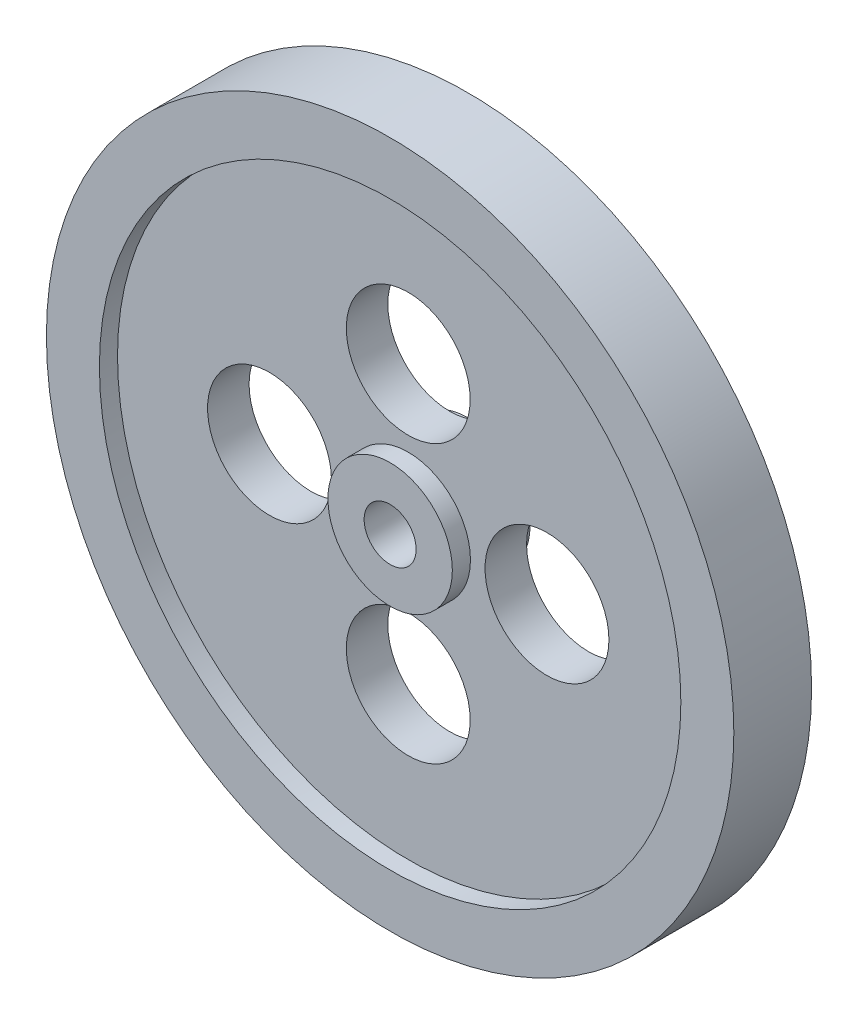
ISO-10303-21;
HEADER;
FILE_DESCRIPTION(('STEP AP214'),'2;1');
FILE_NAME('part.step','',(''),(''),'','','');
FILE_SCHEMA(('AUTOMOTIVE_DESIGN { 1 0 10303 214 1 1 1 1 }'));
ENDSEC;
DATA;
#1=APPLICATION_CONTEXT('core data for automotive mechanical design processes');
#2=APPLICATION_PROTOCOL_DEFINITION('international standard','automotive_design',2000,#1);
#3=PRODUCT_CONTEXT('',#1,'mechanical');
#4=PRODUCT('Part','Part','',(#3));
#5=PRODUCT_RELATED_PRODUCT_CATEGORY('part','',(#4));
#6=PRODUCT_DEFINITION_FORMATION('','',#4);
#7=PRODUCT_DEFINITION_CONTEXT('part definition',#1,'design');
#8=PRODUCT_DEFINITION('design','',#6,#7);
#9=PRODUCT_DEFINITION_SHAPE('','',#8);
#10=(LENGTH_UNIT() NAMED_UNIT(*) SI_UNIT(.MILLI.,.METRE.));
#11=(NAMED_UNIT(*) PLANE_ANGLE_UNIT() SI_UNIT($,.RADIAN.));
#12=(NAMED_UNIT(*) SI_UNIT($,.STERADIAN.) SOLID_ANGLE_UNIT());
#13=UNCERTAINTY_MEASURE_WITH_UNIT(LENGTH_MEASURE(1.E-05),#10,'distance_accuracy_value','');
#14=(GEOMETRIC_REPRESENTATION_CONTEXT(3) GLOBAL_UNCERTAINTY_ASSIGNED_CONTEXT((#13)) GLOBAL_UNIT_ASSIGNED_CONTEXT((#10,
#11,#12)) REPRESENTATION_CONTEXT('',''));
#15=CARTESIAN_POINT('',(0.,0.,0.));
#16=DIRECTION('',(0.,0.,1.));
#17=DIRECTION('',(1.,0.,0.));
#18=AXIS2_PLACEMENT_3D('',#15,#16,#17);
#19=CARTESIAN_POINT('',(0.,0.,-2.79));
#20=DIRECTION('',(0.,0.,1.));
#21=DIRECTION('',(1.,0.,0.));
#22=AXIS2_PLACEMENT_3D('',#19,#20,#21);
#23=PLANE('',#22);
#24=CARTESIAN_POINT('',(0.,0.,-2.79));
#25=DIRECTION('',(0.,0.,1.));
#26=DIRECTION('',(1.,0.,0.));
#27=AXIS2_PLACEMENT_3D('',#24,#25,#26);
#28=CIRCLE('',#27,1.8669);
#29=CARTESIAN_POINT('',(1.8669,0.,-2.79));
#30=VERTEX_POINT('',#29);
#31=EDGE_CURVE('E52',#30,#30,#28,.T.);
#32=ORIENTED_EDGE('',*,*,#31,.T.);
#33=EDGE_LOOP('',(#32));
#34=FACE_BOUND('',#33,.T.);
#35=CARTESIAN_POINT('',(0.,0.,-2.79));
#36=DIRECTION('',(0.,0.,1.));
#37=DIRECTION('',(1.,0.,0.));
#38=AXIS2_PLACEMENT_3D('',#35,#36,#37);
#39=CIRCLE('',#38,4.465);
#40=CARTESIAN_POINT('',(4.465,0.,-2.79));
#41=VERTEX_POINT('',#40);
#42=EDGE_CURVE('E97',#41,#41,#39,.T.);
#43=ORIENTED_EDGE('',*,*,#42,.F.);
#44=EDGE_LOOP('',(#43));
#45=FACE_BOUND('',#44,.T.);
#46=ADVANCED_FACE('F37',(#34,#45),#23,.F.);
#47=CARTESIAN_POINT('',(-9.9568,1.0364604480397E-13,-2.79));
#48=DIRECTION('',(0.,0.,1.));
#49=DIRECTION('',(1.,0.,0.));
#50=AXIS2_PLACEMENT_3D('',#47,#48,#49);
#51=CYLINDRICAL_SURFACE('',#50,4.445);
#52=CARTESIAN_POINT('',(-9.9568,1.0364604480397E-13,1.49));
#53=DIRECTION('',(0.,0.,1.));
#54=DIRECTION('',(1.,0.,0.));
#55=AXIS2_PLACEMENT_3D('',#52,#53,#54);
#56=CIRCLE('',#55,4.445);
#57=CARTESIAN_POINT('',(-5.5118,1.0364604480397E-13,1.49));
#58=VERTEX_POINT('',#57);
#59=EDGE_CURVE('E70',#58,#58,#56,.T.);
#60=ORIENTED_EDGE('',*,*,#59,.T.);
#61=EDGE_LOOP('',(#60));
#62=FACE_BOUND('',#61,.T.);
#63=CARTESIAN_POINT('',(-9.9568,1.0364604480397E-13,-1.49));
#64=DIRECTION('',(0.,0.,-1.));
#65=DIRECTION('',(-1.,0.,0.));
#66=AXIS2_PLACEMENT_3D('',#63,#64,#65);
#67=CIRCLE('',#66,4.445);
#68=CARTESIAN_POINT('',(-14.4018,1.0364604480397E-13,-1.49));
#69=VERTEX_POINT('',#68);
#70=EDGE_CURVE('E74',#69,#69,#67,.F.);
#71=ORIENTED_EDGE('',*,*,#70,.F.);
#72=EDGE_LOOP('',(#71));
#73=FACE_BOUND('',#72,.T.);
#74=ADVANCED_FACE('F114',(#62,#73),#51,.F.);
#75=CARTESIAN_POINT('',(-1.03036366641483E-13,-9.9568,-2.79));
#76=DIRECTION('',(0.,0.,1.));
#77=DIRECTION('',(1.,0.,0.));
#78=AXIS2_PLACEMENT_3D('',#75,#76,#77);
#79=CYLINDRICAL_SURFACE('',#78,4.445);
#80=CARTESIAN_POINT('',(-1.03036366641483E-13,-9.9568,1.49));
#81=DIRECTION('',(0.,0.,1.));
#82=DIRECTION('',(1.,0.,0.));
#83=AXIS2_PLACEMENT_3D('',#80,#81,#82);
#84=CIRCLE('',#83,4.445);
#85=CARTESIAN_POINT('',(4.4449999999999,-9.9568,1.49));
#86=VERTEX_POINT('',#85);
#87=EDGE_CURVE('E73',#86,#86,#84,.T.);
#88=ORIENTED_EDGE('',*,*,#87,.T.);
#89=EDGE_LOOP('',(#88));
#90=FACE_BOUND('',#89,.T.);
#91=CARTESIAN_POINT('',(-1.03036366641483E-13,-9.9568,-1.49));
#92=DIRECTION('',(0.,0.,-1.));
#93=DIRECTION('',(-1.,0.,0.));
#94=AXIS2_PLACEMENT_3D('',#91,#92,#93);
#95=CIRCLE('',#94,4.445);
#96=CARTESIAN_POINT('',(-4.4450000000001,-9.9568,-1.49));
#97=VERTEX_POINT('',#96);
#98=EDGE_CURVE('E84',#97,#97,#95,.F.);
#99=ORIENTED_EDGE('',*,*,#98,.F.);
#100=EDGE_LOOP('',(#99));
#101=FACE_BOUND('',#100,.T.);
#102=ADVANCED_FACE('F121',(#90,#101),#79,.F.);
#103=CARTESIAN_POINT('',(9.9568,-1.0364604480397E-13,-2.79));
#104=DIRECTION('',(0.,0.,1.));
#105=DIRECTION('',(1.,0.,0.));
#106=AXIS2_PLACEMENT_3D('',#103,#104,#105);
#107=CYLINDRICAL_SURFACE('',#106,4.445);
#108=CARTESIAN_POINT('',(9.9568,-1.0364604480397E-13,1.49));
#109=DIRECTION('',(0.,0.,1.));
#110=DIRECTION('',(1.,0.,0.));
#111=AXIS2_PLACEMENT_3D('',#108,#109,#110);
#112=CIRCLE('',#111,4.445);
#113=CARTESIAN_POINT('',(14.4018,-1.0364604480397E-13,1.49));
#114=VERTEX_POINT('',#113);
#115=EDGE_CURVE('E77',#114,#114,#112,.T.);
#116=ORIENTED_EDGE('',*,*,#115,.T.);
#117=EDGE_LOOP('',(#116));
#118=FACE_BOUND('',#117,.T.);
#119=CARTESIAN_POINT('',(9.9568,-1.0364604480397E-13,-1.49));
#120=DIRECTION('',(0.,0.,-1.));
#121=DIRECTION('',(-1.,0.,0.));
#122=AXIS2_PLACEMENT_3D('',#119,#120,#121);
#123=CIRCLE('',#122,4.445);
#124=CARTESIAN_POINT('',(5.5118,-1.0364604480397E-13,-1.49));
#125=VERTEX_POINT('',#124);
#126=EDGE_CURVE('E87',#125,#125,#123,.F.);
#127=ORIENTED_EDGE('',*,*,#126,.F.);
#128=EDGE_LOOP('',(#127));
#129=FACE_BOUND('',#128,.T.);
#130=ADVANCED_FACE('F154',(#118,#129),#107,.F.);
#131=CARTESIAN_POINT('',(0.,9.9568,-2.79));
#132=DIRECTION('',(0.,0.,1.));
#133=DIRECTION('',(1.,0.,0.));
#134=AXIS2_PLACEMENT_3D('',#131,#132,#133);
#135=CYLINDRICAL_SURFACE('',#134,4.4450000000001);
#136=CARTESIAN_POINT('',(0.,9.9568,1.49));
#137=DIRECTION('',(0.,0.,1.));
#138=DIRECTION('',(1.,0.,0.));
#139=AXIS2_PLACEMENT_3D('',#136,#137,#138);
#140=CIRCLE('',#139,4.4450000000001);
#141=CARTESIAN_POINT('',(4.4450000000001,9.9568,1.49));
#142=VERTEX_POINT('',#141);
#143=EDGE_CURVE('E67',#142,#142,#140,.T.);
#144=ORIENTED_EDGE('',*,*,#143,.T.);
#145=EDGE_LOOP('',(#144));
#146=FACE_BOUND('',#145,.T.);
#147=CARTESIAN_POINT('',(0.,9.9568,-1.49));
#148=DIRECTION('',(0.,0.,-1.));
#149=DIRECTION('',(-1.,0.,0.));
#150=AXIS2_PLACEMENT_3D('',#147,#148,#149);
#151=CIRCLE('',#150,4.4450000000001);
#152=CARTESIAN_POINT('',(-4.4450000000001,9.9568,-1.49));
#153=VERTEX_POINT('',#152);
#154=EDGE_CURVE('E41',#153,#153,#151,.F.);
#155=ORIENTED_EDGE('',*,*,#154,.F.);
#156=EDGE_LOOP('',(#155));
#157=FACE_BOUND('',#156,.T.);
#158=ADVANCED_FACE('F152',(#146,#157),#135,.F.);
#159=CARTESIAN_POINT('',(0.,0.,2.79));
#160=DIRECTION('',(0.,0.,1.));
#161=DIRECTION('',(1.,0.,0.));
#162=AXIS2_PLACEMENT_3D('',#159,#160,#161);
#163=PLANE('',#162);
#164=CARTESIAN_POINT('',(0.,0.,2.79));
#165=DIRECTION('',(0.,0.,1.));
#166=DIRECTION('',(1.,0.,0.));
#167=AXIS2_PLACEMENT_3D('',#164,#165,#166);
#168=CIRCLE('',#167,1.8669);
#169=CARTESIAN_POINT('',(1.8669,0.,2.79));
#170=VERTEX_POINT('',#169);
#171=EDGE_CURVE('E50',#170,#170,#168,.T.);
#172=ORIENTED_EDGE('',*,*,#171,.F.);
#173=EDGE_LOOP('',(#172));
#174=FACE_BOUND('',#173,.T.);
#175=CARTESIAN_POINT('',(0.,0.,2.79));
#176=DIRECTION('',(0.,0.,1.));
#177=DIRECTION('',(1.,0.,0.));
#178=AXIS2_PLACEMENT_3D('',#175,#176,#177);
#179=CIRCLE('',#178,4.465);
#180=CARTESIAN_POINT('',(4.465,0.,2.79));
#181=VERTEX_POINT('',#180);
#182=EDGE_CURVE('E64',#181,#181,#179,.T.);
#183=ORIENTED_EDGE('',*,*,#182,.T.);
#184=EDGE_LOOP('',(#183));
#185=FACE_BOUND('',#184,.T.);
#186=ADVANCED_FACE('F136',(#174,#185),#163,.T.);
#187=CARTESIAN_POINT('',(0.,0.,2.79));
#188=DIRECTION('',(0.,0.,1.));
#189=DIRECTION('',(1.,0.,0.));
#190=AXIS2_PLACEMENT_3D('',#187,#188,#189);
#191=CIRCLE('',#190,20.865);
#192=CARTESIAN_POINT('',(20.865,0.,2.79));
#193=VERTEX_POINT('',#192);
#194=EDGE_CURVE('E58',#193,#193,#191,.T.);
#195=ORIENTED_EDGE('',*,*,#194,.F.);
#196=EDGE_LOOP('',(#195));
#197=FACE_BOUND('',#196,.T.);
#198=CARTESIAN_POINT('',(0.,0.,2.79));
#199=DIRECTION('',(0.,0.,1.));
#200=DIRECTION('',(1.,0.,0.));
#201=AXIS2_PLACEMENT_3D('',#198,#199,#200);
#202=CIRCLE('',#201,24.66826923);
#203=CARTESIAN_POINT('',(24.66826923,0.,2.79));
#204=VERTEX_POINT('',#203);
#205=EDGE_CURVE('E10',#204,#204,#202,.T.);
#206=ORIENTED_EDGE('',*,*,#205,.T.);
#207=EDGE_LOOP('',(#206));
#208=FACE_BOUND('',#207,.T.);
#209=ADVANCED_FACE('F126',(#197,#208),#163,.T.);
#210=CARTESIAN_POINT('',(0.,0.,-2.79));
#211=DIRECTION('',(0.,0.,1.));
#212=DIRECTION('',(1.,0.,0.));
#213=AXIS2_PLACEMENT_3D('',#210,#211,#212);
#214=CIRCLE('',#213,20.865);
#215=CARTESIAN_POINT('',(20.865,0.,-2.79));
#216=VERTEX_POINT('',#215);
#217=EDGE_CURVE('E90',#216,#216,#214,.T.);
#218=ORIENTED_EDGE('',*,*,#217,.T.);
#219=EDGE_LOOP('',(#218));
#220=FACE_BOUND('',#219,.T.);
#221=CARTESIAN_POINT('',(0.,0.,-2.79));
#222=DIRECTION('',(0.,0.,1.));
#223=DIRECTION('',(1.,0.,0.));
#224=AXIS2_PLACEMENT_3D('',#221,#222,#223);
#225=CIRCLE('',#224,24.66826923);
#226=CARTESIAN_POINT('',(24.66826923,0.,-2.79));
#227=VERTEX_POINT('',#226);
#228=EDGE_CURVE('E45',#227,#227,#225,.T.);
#229=ORIENTED_EDGE('',*,*,#228,.F.);
#230=EDGE_LOOP('',(#229));
#231=FACE_BOUND('',#230,.T.);
#232=ADVANCED_FACE('F116',(#220,#231),#23,.F.);
#233=CARTESIAN_POINT('',(0.,0.,2.79));
#234=DIRECTION('',(0.,0.,-1.));
#235=DIRECTION('',(-1.,0.,0.));
#236=AXIS2_PLACEMENT_3D('',#233,#234,#235);
#237=CYLINDRICAL_SURFACE('',#236,24.66826923);
#238=ORIENTED_EDGE('',*,*,#205,.F.);
#239=EDGE_LOOP('',(#238));
#240=FACE_BOUND('',#239,.T.);
#241=ORIENTED_EDGE('',*,*,#228,.T.);
#242=EDGE_LOOP('',(#241));
#243=FACE_BOUND('',#242,.T.);
#244=ADVANCED_FACE('F39',(#240,#243),#237,.T.);
#245=CARTESIAN_POINT('',(0.,0.,2.79));
#246=DIRECTION('',(0.,0.,-1.));
#247=DIRECTION('',(-1.,0.,0.));
#248=AXIS2_PLACEMENT_3D('',#245,#246,#247);
#249=CYLINDRICAL_SURFACE('',#248,1.8669);
#250=ORIENTED_EDGE('',*,*,#171,.T.);
#251=EDGE_LOOP('',(#250));
#252=FACE_BOUND('',#251,.T.);
#253=ORIENTED_EDGE('',*,*,#31,.F.);
#254=EDGE_LOOP('',(#253));
#255=FACE_BOUND('',#254,.T.);
#256=ADVANCED_FACE('F133',(#252,#255),#249,.F.);
#257=CARTESIAN_POINT('',(0.,0.,1.49));
#258=DIRECTION('',(0.,0.,1.));
#259=DIRECTION('',(1.,0.,0.));
#260=AXIS2_PLACEMENT_3D('',#257,#258,#259);
#261=CYLINDRICAL_SURFACE('',#260,20.865);
#262=CARTESIAN_POINT('',(0.,0.,1.49));
#263=DIRECTION('',(0.,0.,1.));
#264=DIRECTION('',(1.,0.,0.));
#265=AXIS2_PLACEMENT_3D('',#262,#263,#264);
#266=CIRCLE('',#265,20.865);
#267=CARTESIAN_POINT('',(20.865,0.,1.49));
#268=VERTEX_POINT('',#267);
#269=EDGE_CURVE('E55',#268,#268,#266,.T.);
#270=ORIENTED_EDGE('',*,*,#269,.F.);
#271=EDGE_LOOP('',(#270));
#272=FACE_BOUND('',#271,.T.);
#273=ORIENTED_EDGE('',*,*,#194,.T.);
#274=EDGE_LOOP('',(#273));
#275=FACE_BOUND('',#274,.T.);
#276=ADVANCED_FACE('F167',(#272,#275),#261,.F.);
#277=CARTESIAN_POINT('',(0.,0.,1.49));
#278=DIRECTION('',(0.,0.,1.));
#279=DIRECTION('',(1.,0.,0.));
#280=AXIS2_PLACEMENT_3D('',#277,#278,#279);
#281=PLANE('',#280);
#282=ORIENTED_EDGE('',*,*,#143,.F.);
#283=EDGE_LOOP('',(#282));
#284=FACE_BOUND('',#283,.T.);
#285=ORIENTED_EDGE('',*,*,#115,.F.);
#286=EDGE_LOOP('',(#285));
#287=FACE_BOUND('',#286,.T.);
#288=ORIENTED_EDGE('',*,*,#87,.F.);
#289=EDGE_LOOP('',(#288));
#290=FACE_BOUND('',#289,.T.);
#291=ORIENTED_EDGE('',*,*,#59,.F.);
#292=EDGE_LOOP('',(#291));
#293=FACE_BOUND('',#292,.T.);
#294=CARTESIAN_POINT('',(0.,0.,1.49));
#295=DIRECTION('',(0.,0.,1.));
#296=DIRECTION('',(1.,0.,0.));
#297=AXIS2_PLACEMENT_3D('',#294,#295,#296);
#298=CIRCLE('',#297,4.465);
#299=CARTESIAN_POINT('',(4.465,0.,1.49));
#300=VERTEX_POINT('',#299);
#301=EDGE_CURVE('E61',#300,#300,#298,.T.);
#302=ORIENTED_EDGE('',*,*,#301,.F.);
#303=EDGE_LOOP('',(#302));
#304=FACE_BOUND('',#303,.T.);
#305=ORIENTED_EDGE('',*,*,#269,.T.);
#306=EDGE_LOOP('',(#305));
#307=FACE_BOUND('',#306,.T.);
#308=ADVANCED_FACE('F164',(#284,#287,#290,#293,#304,#307),#281,.T.);
#309=CARTESIAN_POINT('',(0.,0.,1.49));
#310=DIRECTION('',(0.,0.,1.));
#311=DIRECTION('',(1.,0.,0.));
#312=AXIS2_PLACEMENT_3D('',#309,#310,#311);
#313=CYLINDRICAL_SURFACE('',#312,4.465);
#314=ORIENTED_EDGE('',*,*,#301,.T.);
#315=EDGE_LOOP('',(#314));
#316=FACE_BOUND('',#315,.T.);
#317=ORIENTED_EDGE('',*,*,#182,.F.);
#318=EDGE_LOOP('',(#317));
#319=FACE_BOUND('',#318,.T.);
#320=ADVANCED_FACE('F148',(#316,#319),#313,.T.);
#321=CARTESIAN_POINT('',(0.,0.,-1.49));
#322=DIRECTION('',(0.,0.,-1.));
#323=DIRECTION('',(1.,0.,0.));
#324=AXIS2_PLACEMENT_3D('',#321,#322,#323);
#325=PLANE('',#324);
#326=CARTESIAN_POINT('',(0.,0.,-1.49));
#327=DIRECTION('',(0.,0.,1.));
#328=DIRECTION('',(1.,0.,0.));
#329=AXIS2_PLACEMENT_3D('',#326,#327,#328);
#330=CIRCLE('',#329,20.865);
#331=CARTESIAN_POINT('',(20.865,0.,-1.49));
#332=VERTEX_POINT('',#331);
#333=EDGE_CURVE('E93',#332,#332,#330,.T.);
#334=ORIENTED_EDGE('',*,*,#333,.F.);
#335=EDGE_LOOP('',(#334));
#336=FACE_BOUND('',#335,.T.);
#337=CARTESIAN_POINT('',(0.,0.,-1.49));
#338=DIRECTION('',(0.,0.,1.));
#339=DIRECTION('',(1.,0.,0.));
#340=AXIS2_PLACEMENT_3D('',#337,#338,#339);
#341=CIRCLE('',#340,4.465);
#342=CARTESIAN_POINT('',(4.465,0.,-1.49));
#343=VERTEX_POINT('',#342);
#344=EDGE_CURVE('E94',#343,#343,#341,.T.);
#345=ORIENTED_EDGE('',*,*,#344,.T.);
#346=EDGE_LOOP('',(#345));
#347=FACE_BOUND('',#346,.T.);
#348=ORIENTED_EDGE('',*,*,#154,.T.);
#349=EDGE_LOOP('',(#348));
#350=FACE_BOUND('',#349,.T.);
#351=ORIENTED_EDGE('',*,*,#126,.T.);
#352=EDGE_LOOP('',(#351));
#353=FACE_BOUND('',#352,.T.);
#354=ORIENTED_EDGE('',*,*,#98,.T.);
#355=EDGE_LOOP('',(#354));
#356=FACE_BOUND('',#355,.T.);
#357=ORIENTED_EDGE('',*,*,#70,.T.);
#358=EDGE_LOOP('',(#357));
#359=FACE_BOUND('',#358,.T.);
#360=ADVANCED_FACE('F103',(#336,#347,#350,#353,#356,#359),#325,.T.);
#361=CARTESIAN_POINT('',(0.,0.,-1.49));
#362=DIRECTION('',(0.,0.,-1.));
#363=DIRECTION('',(-1.,0.,0.));
#364=AXIS2_PLACEMENT_3D('',#361,#362,#363);
#365=CYLINDRICAL_SURFACE('',#364,20.865);
#366=ORIENTED_EDGE('',*,*,#333,.T.);
#367=EDGE_LOOP('',(#366));
#368=FACE_BOUND('',#367,.T.);
#369=ORIENTED_EDGE('',*,*,#217,.F.);
#370=EDGE_LOOP('',(#369));
#371=FACE_BOUND('',#370,.T.);
#372=ADVANCED_FACE('F109',(#368,#371),#365,.F.);
#373=CARTESIAN_POINT('',(0.,0.,-1.49));
#374=DIRECTION('',(0.,0.,-1.));
#375=DIRECTION('',(-1.,0.,0.));
#376=AXIS2_PLACEMENT_3D('',#373,#374,#375);
#377=CYLINDRICAL_SURFACE('',#376,4.465);
#378=ORIENTED_EDGE('',*,*,#344,.F.);
#379=EDGE_LOOP('',(#378));
#380=FACE_BOUND('',#379,.T.);
#381=ORIENTED_EDGE('',*,*,#42,.T.);
#382=EDGE_LOOP('',(#381));
#383=FACE_BOUND('',#382,.T.);
#384=ADVANCED_FACE('F106',(#380,#383),#377,.T.);
#385=CLOSED_SHELL('',(#46,#74,#102,#130,#158,#186,#209,#232,#244,#256,#276,#308,#320,#360,#372,#384));
#386=MANIFOLD_SOLID_BREP('B2',#385);
#387=ADVANCED_BREP_SHAPE_REPRESENTATION('',(#18,#386),#14);
#388=SHAPE_DEFINITION_REPRESENTATION(#9,#387);
ENDSEC;
END-ISO-10303-21;
